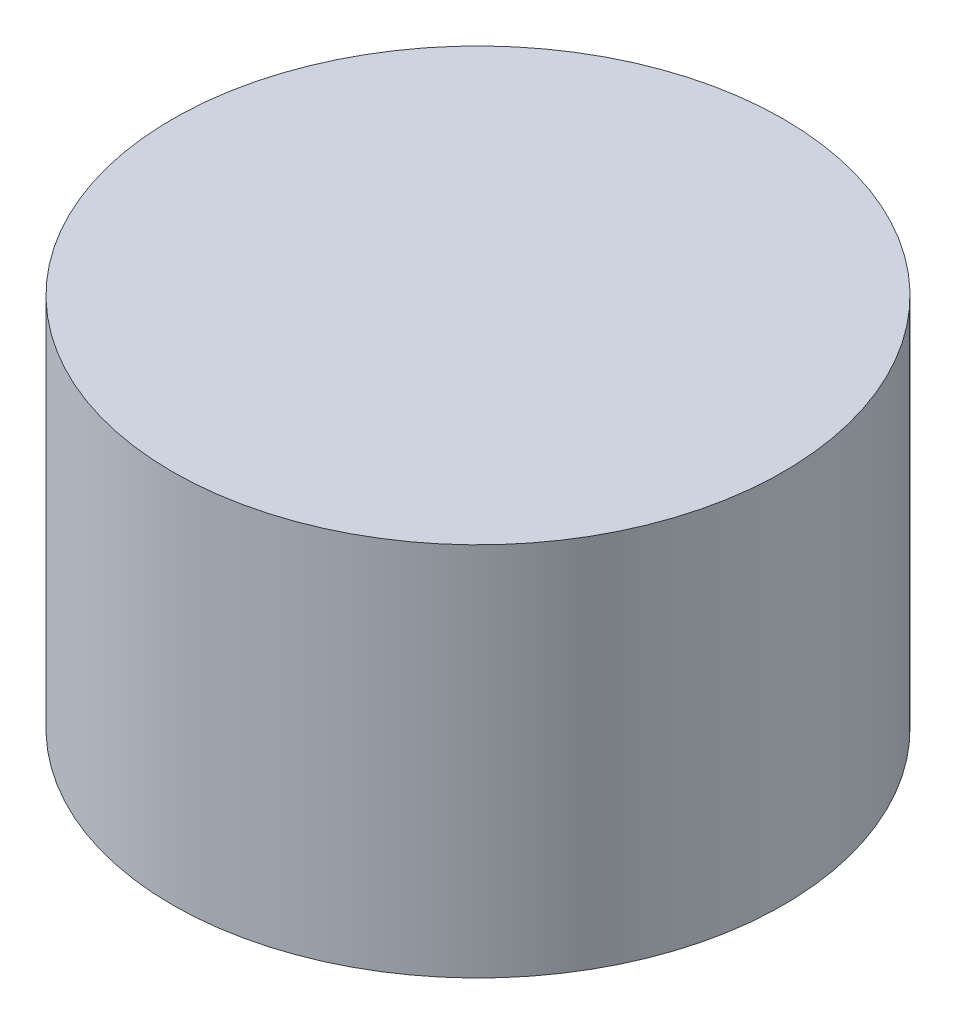
ISO-10303-21;
HEADER;
FILE_DESCRIPTION(('STEP AP214'),'2;1');
FILE_NAME('part.step','',(''),(''),'','','');
FILE_SCHEMA(('AUTOMOTIVE_DESIGN { 1 0 10303 214 1 1 1 1 }'));
ENDSEC;
DATA;
#1=APPLICATION_CONTEXT('core data for automotive mechanical design processes');
#2=APPLICATION_PROTOCOL_DEFINITION('international standard','automotive_design',2000,#1);
#3=PRODUCT_CONTEXT('',#1,'mechanical');
#4=PRODUCT('Part','Part','',(#3));
#5=PRODUCT_RELATED_PRODUCT_CATEGORY('part','',(#4));
#6=PRODUCT_DEFINITION_FORMATION('','',#4);
#7=PRODUCT_DEFINITION_CONTEXT('part definition',#1,'design');
#8=PRODUCT_DEFINITION('design','',#6,#7);
#9=PRODUCT_DEFINITION_SHAPE('','',#8);
#10=(LENGTH_UNIT() NAMED_UNIT(*) SI_UNIT(.MILLI.,.METRE.));
#11=(NAMED_UNIT(*) PLANE_ANGLE_UNIT() SI_UNIT($,.RADIAN.));
#12=(NAMED_UNIT(*) SI_UNIT($,.STERADIAN.) SOLID_ANGLE_UNIT());
#13=UNCERTAINTY_MEASURE_WITH_UNIT(LENGTH_MEASURE(1.E-05),#10,'distance_accuracy_value','');
#14=(GEOMETRIC_REPRESENTATION_CONTEXT(3) GLOBAL_UNCERTAINTY_ASSIGNED_CONTEXT((#13)) GLOBAL_UNIT_ASSIGNED_CONTEXT((#10,
#11,#12)) REPRESENTATION_CONTEXT('',''));
#15=CARTESIAN_POINT('',(0.,0.,0.));
#16=DIRECTION('',(0.,0.,1.));
#17=DIRECTION('',(1.,0.,0.));
#18=AXIS2_PLACEMENT_3D('',#15,#16,#17);
#19=CARTESIAN_POINT('',(260.,-89.5,1687.5));
#20=DIRECTION('',(0.,-1.,0.));
#21=DIRECTION('',(0.,0.,-1.));
#22=AXIS2_PLACEMENT_3D('',#19,#20,#21);
#23=PLANE('',#22);
#24=CARTESIAN_POINT('',(260.,-89.5,1687.5));
#25=DIRECTION('',(0.,-1.,0.));
#26=DIRECTION('',(0.,0.,-1.));
#27=AXIS2_PLACEMENT_3D('',#24,#25,#26);
#28=CIRCLE('',#27,42.3456584031692);
#29=CARTESIAN_POINT('',(260.,-89.5,1645.15434159683));
#30=VERTEX_POINT('',#29);
#31=EDGE_CURVE('E18',#30,#30,#28,.F.);
#32=ORIENTED_EDGE('',*,*,#31,.F.);
#33=EDGE_LOOP('',(#32));
#34=FACE_BOUND('',#33,.T.);
#35=ADVANCED_FACE('F15',(#34),#23,.T.);
#36=CARTESIAN_POINT('',(70.0000000000035,-37.5,1778.));
#37=DIRECTION('',(0.,1.,0.));
#38=DIRECTION('',(0.,0.,1.));
#39=AXIS2_PLACEMENT_3D('',#36,#37,#38);
#40=PLANE('',#39);
#41=CARTESIAN_POINT('',(260.,-37.5,1687.5));
#42=DIRECTION('',(0.,-1.,0.));
#43=DIRECTION('',(0.,0.,-1.));
#44=AXIS2_PLACEMENT_3D('',#41,#42,#43);
#45=CIRCLE('',#44,42.3456584031692);
#46=CARTESIAN_POINT('',(260.,-37.5,1645.15434159683));
#47=VERTEX_POINT('',#46);
#48=EDGE_CURVE('E10',#47,#47,#45,.T.);
#49=ORIENTED_EDGE('',*,*,#48,.F.);
#50=EDGE_LOOP('',(#49));
#51=FACE_BOUND('',#50,.T.);
#52=ADVANCED_FACE('F30',(#51),#40,.T.);
#53=CARTESIAN_POINT('',(260.,82.2716088427603,1687.5));
#54=DIRECTION('',(0.,-1.,0.));
#55=DIRECTION('',(0.,0.,-1.));
#56=AXIS2_PLACEMENT_3D('',#53,#54,#55);
#57=CYLINDRICAL_SURFACE('',#56,42.3456584031692);
#58=ORIENTED_EDGE('',*,*,#48,.T.);
#59=EDGE_LOOP('',(#58));
#60=FACE_BOUND('',#59,.T.);
#61=ORIENTED_EDGE('',*,*,#31,.T.);
#62=EDGE_LOOP('',(#61));
#63=FACE_BOUND('',#62,.T.);
#64=ADVANCED_FACE('F27',(#60,#63),#57,.T.);
#65=CLOSED_SHELL('',(#35,#52,#64));
#66=MANIFOLD_SOLID_BREP('B1',#65);
#67=ADVANCED_BREP_SHAPE_REPRESENTATION('',(#18,#66),#14);
#68=SHAPE_DEFINITION_REPRESENTATION(#9,#67);
ENDSEC;
END-ISO-10303-21;
